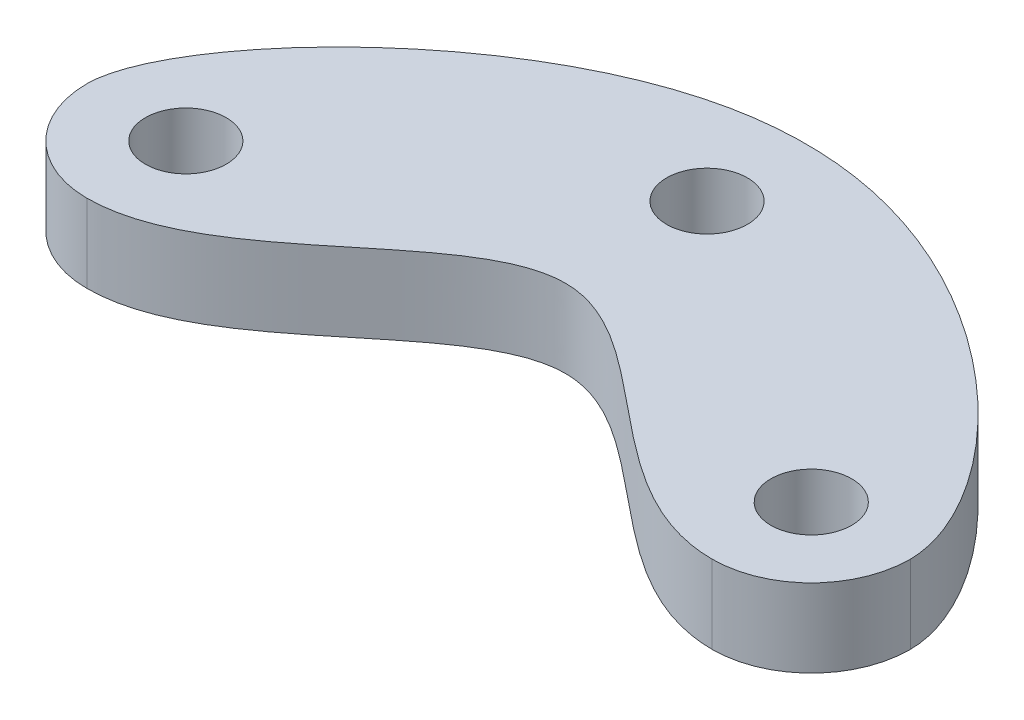
ISO-10303-21;
HEADER;
FILE_DESCRIPTION(('STEP AP214'),'2;1');
FILE_NAME('part.step','',(''),(''),'','','');
FILE_SCHEMA(('AUTOMOTIVE_DESIGN { 1 0 10303 214 1 1 1 1 }'));
ENDSEC;
DATA;
#1=APPLICATION_CONTEXT('core data for automotive mechanical design processes');
#2=APPLICATION_PROTOCOL_DEFINITION('international standard','automotive_design',2000,#1);
#3=PRODUCT_CONTEXT('',#1,'mechanical');
#4=PRODUCT('Part','Part','',(#3));
#5=PRODUCT_RELATED_PRODUCT_CATEGORY('part','',(#4));
#6=PRODUCT_DEFINITION_FORMATION('','',#4);
#7=PRODUCT_DEFINITION_CONTEXT('part definition',#1,'design');
#8=PRODUCT_DEFINITION('design','',#6,#7);
#9=PRODUCT_DEFINITION_SHAPE('','',#8);
#10=(LENGTH_UNIT() NAMED_UNIT(*) SI_UNIT(.MILLI.,.METRE.));
#11=(NAMED_UNIT(*) PLANE_ANGLE_UNIT() SI_UNIT($,.RADIAN.));
#12=(NAMED_UNIT(*) SI_UNIT($,.STERADIAN.) SOLID_ANGLE_UNIT());
#13=UNCERTAINTY_MEASURE_WITH_UNIT(LENGTH_MEASURE(1.E-05),#10,'distance_accuracy_value','');
#14=(GEOMETRIC_REPRESENTATION_CONTEXT(3) GLOBAL_UNCERTAINTY_ASSIGNED_CONTEXT((#13)) GLOBAL_UNIT_ASSIGNED_CONTEXT((#10,
#11,#12)) REPRESENTATION_CONTEXT('',''));
#15=CARTESIAN_POINT('',(0.,0.,0.));
#16=DIRECTION('',(0.,0.,1.));
#17=DIRECTION('',(1.,0.,0.));
#18=AXIS2_PLACEMENT_3D('',#15,#16,#17);
#19=CARTESIAN_POINT('',(0.23072712750348,6.,-23.5990327156532));
#20=DIRECTION('',(0.,1.,0.));
#21=DIRECTION('',(0.,0.,1.));
#22=AXIS2_PLACEMENT_3D('',#19,#20,#21);
#23=PLANE('',#22);
#24=CARTESIAN_POINT('',(24.,6.,0.));
#25=DIRECTION('',(0.,1.,0.));
#26=DIRECTION('',(0.,0.,1.));
#27=AXIS2_PLACEMENT_3D('',#24,#25,#26);
#28=CIRCLE('',#27,3.1);
#29=CARTESIAN_POINT('',(24.,6.,3.09999999999999));
#30=VERTEX_POINT('',#29);
#31=EDGE_CURVE('E161',#30,#30,#28,.T.);
#32=ORIENTED_EDGE('',*,*,#31,.F.);
#33=EDGE_LOOP('',(#32));
#34=FACE_BOUND('',#33,.T.);
#35=CARTESIAN_POINT('',(31.6,6.,2.42465280867427E-13));
#36=CARTESIAN_POINT('',(31.5520589527402,6.,-7.12035463049922));
#37=CARTESIAN_POINT('',(16.0196104894674,6.,-23.7040176015557));
#38=CARTESIAN_POINT('',(-15.8739530379947,6.,-23.7758006646321));
#39=CARTESIAN_POINT('',(-31.577855130659,6.,-6.45395895267553));
#40=CARTESIAN_POINT('',(-31.5999163075859,6.,-0.0356667588972072));
#41=B_SPLINE_CURVE_WITH_KNOTS('',3,(#35,#36,#37,#38,#39,#40),.UNSPECIFIED.,.F.,.F.,(4,1,1,4),
(0.,0.452532694911811,0.552532694911811,1.),.UNSPECIFIED.);
#42=CARTESIAN_POINT('',(31.6,6.,0.));
#43=VERTEX_POINT('',#42);
#44=CARTESIAN_POINT('',(-31.5999163075859,6.,-0.0356667588972078));
#45=VERTEX_POINT('',#44);
#46=EDGE_CURVE('E93',#43,#45,#41,.T.);
#47=ORIENTED_EDGE('',*,*,#46,.T.);
#48=CARTESIAN_POINT('',(-24.,6.,0.));
#49=DIRECTION('',(0.,1.,0.));
#50=DIRECTION('',(0.,0.,1.));
#51=AXIS2_PLACEMENT_3D('',#48,#49,#50);
#52=CIRCLE('',#51,7.60000000000001);
#53=CARTESIAN_POINT('',(-24.,6.,7.6));
#54=VERTEX_POINT('',#53);
#55=EDGE_CURVE('E88',#45,#54,#52,.T.);
#56=ORIENTED_EDGE('',*,*,#55,.T.);
#57=CARTESIAN_POINT('',(-24.,6.,7.6));
#58=CARTESIAN_POINT('',(-14.6682641248603,6.,7.61499574963292));
#59=CARTESIAN_POINT('',(0.0111784660270281,6.,-17.8222060797872));
#60=CARTESIAN_POINT('',(14.6459071928063,6.,7.56607429159867));
#61=CARTESIAN_POINT('',(24.,6.,7.6));
#62=B_SPLINE_CURVE_WITH_KNOTS('',3,(#57,#58,#59,#60,#61),.UNSPECIFIED.,.F.,.F.,(4,1,4),(0.,0.5,
1.),.UNSPECIFIED.);
#63=CARTESIAN_POINT('',(24.,6.,7.6));
#64=VERTEX_POINT('',#63);
#65=EDGE_CURVE('E91',#54,#64,#62,.T.);
#66=ORIENTED_EDGE('',*,*,#65,.T.);
#67=CARTESIAN_POINT('',(24.,6.,0.));
#68=DIRECTION('',(0.,1.,0.));
#69=DIRECTION('',(0.,0.,1.));
#70=AXIS2_PLACEMENT_3D('',#67,#68,#69);
#71=CIRCLE('',#70,7.6);
#72=EDGE_CURVE('E58',#64,#43,#71,.T.);
#73=ORIENTED_EDGE('',*,*,#72,.T.);
#74=EDGE_LOOP('',(#47,#56,#66,#73));
#75=FACE_BOUND('',#74,.T.);
#76=CARTESIAN_POINT('',(-24.,6.,0.));
#77=DIRECTION('',(0.,1.,0.));
#78=DIRECTION('',(0.,0.,1.));
#79=AXIS2_PLACEMENT_3D('',#76,#77,#78);
#80=CIRCLE('',#79,3.1);
#81=CARTESIAN_POINT('',(-24.,6.,3.1));
#82=VERTEX_POINT('',#81);
#83=EDGE_CURVE('E169',#82,#82,#80,.T.);
#84=ORIENTED_EDGE('',*,*,#83,.F.);
#85=EDGE_LOOP('',(#84));
#86=FACE_BOUND('',#85,.T.);
#87=CARTESIAN_POINT('',(0.,6.,-16.));
#88=DIRECTION('',(0.,1.,0.));
#89=DIRECTION('',(0.,0.,1.));
#90=AXIS2_PLACEMENT_3D('',#87,#88,#89);
#91=CIRCLE('',#90,3.1);
#92=CARTESIAN_POINT('',(0.,6.,-12.9));
#93=VERTEX_POINT('',#92);
#94=EDGE_CURVE('E150',#93,#93,#91,.T.);
#95=ORIENTED_EDGE('',*,*,#94,.F.);
#96=EDGE_LOOP('',(#95));
#97=FACE_BOUND('',#96,.T.);
#98=ADVANCED_FACE('F39',(#34,#75,#86,#97),#23,.T.);
#99=CARTESIAN_POINT('',(0.23072712750348,0.,-23.5990327156532));
#100=DIRECTION('',(0.,1.,0.));
#101=DIRECTION('',(0.,0.,1.));
#102=AXIS2_PLACEMENT_3D('',#99,#100,#101);
#103=PLANE('',#102);
#104=CARTESIAN_POINT('',(31.6,0.,2.42465280867427E-13));
#105=CARTESIAN_POINT('',(31.5520589527402,0.,-7.12035463049922));
#106=CARTESIAN_POINT('',(16.0196104894674,0.,-23.7040176015557));
#107=CARTESIAN_POINT('',(-15.8739530379947,0.,-23.7758006646321));
#108=CARTESIAN_POINT('',(-31.577855130659,0.,-6.45395895267553));
#109=CARTESIAN_POINT('',(-31.5999163075859,0.,-0.0356667588972072));
#110=B_SPLINE_CURVE_WITH_KNOTS('',3,(#104,#105,#106,#107,#108,#109),.UNSPECIFIED.,.F.,.F.,(4,1,
1,4),(0.,0.452532694911811,0.552532694911811,1.),.UNSPECIFIED.);
#111=CARTESIAN_POINT('',(31.6,0.,0.));
#112=VERTEX_POINT('',#111);
#113=CARTESIAN_POINT('',(-31.5999163075859,0.,-0.0356667588972078));
#114=VERTEX_POINT('',#113);
#115=EDGE_CURVE('E173',#112,#114,#110,.T.);
#116=ORIENTED_EDGE('',*,*,#115,.F.);
#117=CARTESIAN_POINT('',(24.,0.,0.));
#118=DIRECTION('',(0.,1.,0.));
#119=DIRECTION('',(0.,0.,1.));
#120=AXIS2_PLACEMENT_3D('',#117,#118,#119);
#121=CIRCLE('',#120,7.6);
#122=CARTESIAN_POINT('',(24.,0.,7.6));
#123=VERTEX_POINT('',#122);
#124=EDGE_CURVE('E81',#123,#112,#121,.T.);
#125=ORIENTED_EDGE('',*,*,#124,.F.);
#126=CARTESIAN_POINT('',(-24.,0.,7.6));
#127=CARTESIAN_POINT('',(-14.6682641248603,0.,7.61499574963292));
#128=CARTESIAN_POINT('',(0.0111784660270281,0.,-17.8222060797872));
#129=CARTESIAN_POINT('',(14.6459071928063,0.,7.56607429159867));
#130=CARTESIAN_POINT('',(24.,0.,7.6));
#131=B_SPLINE_CURVE_WITH_KNOTS('',3,(#126,#127,#128,#129,#130),.UNSPECIFIED.,.F.,.F.,(4,1,4),
(0.,0.5,1.),.UNSPECIFIED.);
#132=CARTESIAN_POINT('',(-24.,0.,7.6));
#133=VERTEX_POINT('',#132);
#134=EDGE_CURVE('E75',#133,#123,#131,.T.);
#135=ORIENTED_EDGE('',*,*,#134,.F.);
#136=CARTESIAN_POINT('',(-24.,0.,0.));
#137=DIRECTION('',(0.,1.,0.));
#138=DIRECTION('',(0.,0.,1.));
#139=AXIS2_PLACEMENT_3D('',#136,#137,#138);
#140=CIRCLE('',#139,7.60000000000001);
#141=EDGE_CURVE('E98',#114,#133,#140,.T.);
#142=ORIENTED_EDGE('',*,*,#141,.F.);
#143=EDGE_LOOP('',(#116,#125,#135,#142));
#144=FACE_BOUND('',#143,.T.);
#145=CARTESIAN_POINT('',(-24.,0.,0.));
#146=DIRECTION('',(0.,1.,0.));
#147=DIRECTION('',(0.,0.,1.));
#148=AXIS2_PLACEMENT_3D('',#145,#146,#147);
#149=CIRCLE('',#148,3.1);
#150=CARTESIAN_POINT('',(-24.,0.,3.1));
#151=VERTEX_POINT('',#150);
#152=EDGE_CURVE('E165',#151,#151,#149,.T.);
#153=ORIENTED_EDGE('',*,*,#152,.T.);
#154=EDGE_LOOP('',(#153));
#155=FACE_BOUND('',#154,.T.);
#156=CARTESIAN_POINT('',(24.,0.,0.));
#157=DIRECTION('',(0.,1.,0.));
#158=DIRECTION('',(0.,0.,1.));
#159=AXIS2_PLACEMENT_3D('',#156,#157,#158);
#160=CIRCLE('',#159,3.1);
#161=CARTESIAN_POINT('',(24.,0.,3.09999999999999));
#162=VERTEX_POINT('',#161);
#163=EDGE_CURVE('E158',#162,#162,#160,.T.);
#164=ORIENTED_EDGE('',*,*,#163,.T.);
#165=EDGE_LOOP('',(#164));
#166=FACE_BOUND('',#165,.T.);
#167=CARTESIAN_POINT('',(0.,0.,-16.));
#168=DIRECTION('',(0.,1.,0.));
#169=DIRECTION('',(0.,0.,1.));
#170=AXIS2_PLACEMENT_3D('',#167,#168,#169);
#171=CIRCLE('',#170,3.1);
#172=CARTESIAN_POINT('',(0.,0.,-12.9));
#173=VERTEX_POINT('',#172);
#174=EDGE_CURVE('E153',#173,#173,#171,.T.);
#175=ORIENTED_EDGE('',*,*,#174,.T.);
#176=EDGE_LOOP('',(#175));
#177=FACE_BOUND('',#176,.T.);
#178=ADVANCED_FACE('F123',(#144,#155,#166,#177),#103,.F.);
#179=DIRECTION('',(0.,-1.,0.));
#180=VECTOR('',#179,1.);
#181=SURFACE_OF_LINEAR_EXTRUSION('',#41,#180);
#182=ORIENTED_EDGE('',*,*,#115,.T.);
#183=DIRECTION('',(0.,-1.,0.));
#184=VECTOR('',#183,1.);
#185=CARTESIAN_POINT('',(-31.5999163075859,6.,-0.0356667588972078));
#186=LINE('',#185,#184);
#187=EDGE_CURVE('E11',#45,#114,#186,.T.);
#188=ORIENTED_EDGE('',*,*,#187,.F.);
#189=ORIENTED_EDGE('',*,*,#46,.F.);
#190=DIRECTION('',(0.,-1.,0.));
#191=VECTOR('',#190,1.);
#192=CARTESIAN_POINT('',(31.6,6.,0.));
#193=LINE('',#192,#191);
#194=EDGE_CURVE('E105',#43,#112,#193,.T.);
#195=ORIENTED_EDGE('',*,*,#194,.T.);
#196=EDGE_LOOP('',(#182,#188,#189,#195));
#197=FACE_BOUND('',#196,.T.);
#198=ADVANCED_FACE('F41',(#197),#181,.F.);
#199=CARTESIAN_POINT('',(-24.,6.,0.));
#200=DIRECTION('',(0.,-1.,0.));
#201=DIRECTION('',(0.,0.,-1.));
#202=AXIS2_PLACEMENT_3D('',#199,#200,#201);
#203=CYLINDRICAL_SURFACE('',#202,7.60000000000001);
#204=ORIENTED_EDGE('',*,*,#141,.T.);
#205=DIRECTION('',(0.,-1.,0.));
#206=VECTOR('',#205,1.);
#207=CARTESIAN_POINT('',(-24.,6.,7.6));
#208=LINE('',#207,#206);
#209=EDGE_CURVE('E50',#54,#133,#208,.T.);
#210=ORIENTED_EDGE('',*,*,#209,.F.);
#211=ORIENTED_EDGE('',*,*,#55,.F.);
#212=ORIENTED_EDGE('',*,*,#187,.T.);
#213=EDGE_LOOP('',(#204,#210,#211,#212));
#214=FACE_BOUND('',#213,.T.);
#215=ADVANCED_FACE('F97',(#214),#203,.T.);
#216=DIRECTION('',(0.,-1.,0.));
#217=VECTOR('',#216,1.);
#218=SURFACE_OF_LINEAR_EXTRUSION('',#62,#217);
#219=ORIENTED_EDGE('',*,*,#134,.T.);
#220=DIRECTION('',(0.,-1.,0.));
#221=VECTOR('',#220,1.);
#222=CARTESIAN_POINT('',(24.,6.,7.6));
#223=LINE('',#222,#221);
#224=EDGE_CURVE('E100',#64,#123,#223,.T.);
#225=ORIENTED_EDGE('',*,*,#224,.F.);
#226=ORIENTED_EDGE('',*,*,#65,.F.);
#227=ORIENTED_EDGE('',*,*,#209,.T.);
#228=EDGE_LOOP('',(#219,#225,#226,#227));
#229=FACE_BOUND('',#228,.T.);
#230=ADVANCED_FACE('F101',(#229),#218,.F.);
#231=CARTESIAN_POINT('',(24.,6.,0.));
#232=DIRECTION('',(0.,-1.,0.));
#233=DIRECTION('',(0.,0.,-1.));
#234=AXIS2_PLACEMENT_3D('',#231,#232,#233);
#235=CYLINDRICAL_SURFACE('',#234,7.6);
#236=ORIENTED_EDGE('',*,*,#124,.T.);
#237=ORIENTED_EDGE('',*,*,#194,.F.);
#238=ORIENTED_EDGE('',*,*,#72,.F.);
#239=ORIENTED_EDGE('',*,*,#224,.T.);
#240=EDGE_LOOP('',(#236,#237,#238,#239));
#241=FACE_BOUND('',#240,.T.);
#242=ADVANCED_FACE('F117',(#241),#235,.T.);
#243=CARTESIAN_POINT('',(-24.,6.,0.));
#244=DIRECTION('',(0.,-1.,0.));
#245=DIRECTION('',(0.,0.,-1.));
#246=AXIS2_PLACEMENT_3D('',#243,#244,#245);
#247=CYLINDRICAL_SURFACE('',#246,3.1);
#248=ORIENTED_EDGE('',*,*,#83,.T.);
#249=EDGE_LOOP('',(#248));
#250=FACE_BOUND('',#249,.T.);
#251=ORIENTED_EDGE('',*,*,#152,.F.);
#252=EDGE_LOOP('',(#251));
#253=FACE_BOUND('',#252,.T.);
#254=ADVANCED_FACE('F134',(#250,#253),#247,.F.);
#255=CARTESIAN_POINT('',(24.,6.,0.));
#256=DIRECTION('',(0.,-1.,0.));
#257=DIRECTION('',(0.,0.,-1.));
#258=AXIS2_PLACEMENT_3D('',#255,#256,#257);
#259=CYLINDRICAL_SURFACE('',#258,3.1);
#260=ORIENTED_EDGE('',*,*,#31,.T.);
#261=EDGE_LOOP('',(#260));
#262=FACE_BOUND('',#261,.T.);
#263=ORIENTED_EDGE('',*,*,#163,.F.);
#264=EDGE_LOOP('',(#263));
#265=FACE_BOUND('',#264,.T.);
#266=ADVANCED_FACE('F137',(#262,#265),#259,.F.);
#267=CARTESIAN_POINT('',(0.,6.,-16.));
#268=DIRECTION('',(0.,-1.,0.));
#269=DIRECTION('',(0.,0.,-1.));
#270=AXIS2_PLACEMENT_3D('',#267,#268,#269);
#271=CYLINDRICAL_SURFACE('',#270,3.1);
#272=ORIENTED_EDGE('',*,*,#94,.T.);
#273=EDGE_LOOP('',(#272));
#274=FACE_BOUND('',#273,.T.);
#275=ORIENTED_EDGE('',*,*,#174,.F.);
#276=EDGE_LOOP('',(#275));
#277=FACE_BOUND('',#276,.T.);
#278=ADVANCED_FACE('F141',(#274,#277),#271,.F.);
#279=CLOSED_SHELL('',(#98,#178,#198,#215,#230,#242,#254,#266,#278));
#280=MANIFOLD_SOLID_BREP('B2',#279);
#281=ADVANCED_BREP_SHAPE_REPRESENTATION('',(#18,#280),#14);
#282=SHAPE_DEFINITION_REPRESENTATION(#9,#281);
ENDSEC;
END-ISO-10303-21;
